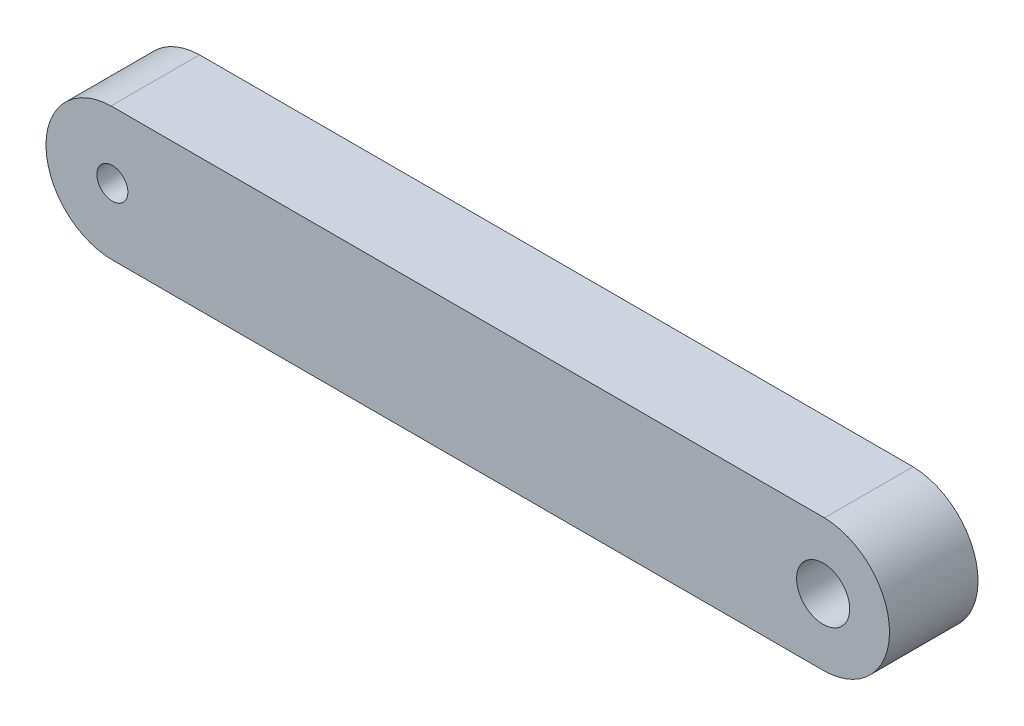
ISO-10303-21;
HEADER;
FILE_DESCRIPTION(('STEP AP214'),'2;1');
FILE_NAME('part.step','',(''),(''),'','','');
FILE_SCHEMA(('AUTOMOTIVE_DESIGN { 1 0 10303 214 1 1 1 1 }'));
ENDSEC;
DATA;
#1=APPLICATION_CONTEXT('core data for automotive mechanical design processes');
#2=APPLICATION_PROTOCOL_DEFINITION('international standard','automotive_design',2000,#1);
#3=PRODUCT_CONTEXT('',#1,'mechanical');
#4=PRODUCT('Part','Part','',(#3));
#5=PRODUCT_RELATED_PRODUCT_CATEGORY('part','',(#4));
#6=PRODUCT_DEFINITION_FORMATION('','',#4);
#7=PRODUCT_DEFINITION_CONTEXT('part definition',#1,'design');
#8=PRODUCT_DEFINITION('design','',#6,#7);
#9=PRODUCT_DEFINITION_SHAPE('','',#8);
#10=(LENGTH_UNIT() NAMED_UNIT(*) SI_UNIT(.MILLI.,.METRE.));
#11=(NAMED_UNIT(*) PLANE_ANGLE_UNIT() SI_UNIT($,.RADIAN.));
#12=(NAMED_UNIT(*) SI_UNIT($,.STERADIAN.) SOLID_ANGLE_UNIT());
#13=UNCERTAINTY_MEASURE_WITH_UNIT(LENGTH_MEASURE(1.E-05),#10,'distance_accuracy_value','');
#14=(GEOMETRIC_REPRESENTATION_CONTEXT(3) GLOBAL_UNCERTAINTY_ASSIGNED_CONTEXT((#13)) GLOBAL_UNIT_ASSIGNED_CONTEXT((#10,
#11,#12)) REPRESENTATION_CONTEXT('',''));
#15=CARTESIAN_POINT('',(0.,0.,0.));
#16=DIRECTION('',(0.,0.,1.));
#17=DIRECTION('',(1.,0.,0.));
#18=AXIS2_PLACEMENT_3D('',#15,#16,#17);
#19=CARTESIAN_POINT('',(0.,9.82318225199968,10.));
#20=DIRECTION('',(0.,1.,0.));
#21=DIRECTION('',(0.,0.,1.));
#22=AXIS2_PLACEMENT_3D('',#19,#20,#21);
#23=PLANE('',#22);
#24=DIRECTION('',(1.,0.,0.));
#25=VECTOR('',#24,1.);
#26=CARTESIAN_POINT('',(0.,9.82318225199968,0.));
#27=LINE('',#26,#25);
#28=CARTESIAN_POINT('',(-47.2764284813482,9.82318225199968,0.));
#29=VERTEX_POINT('',#28);
#30=CARTESIAN_POINT('',(33.3315741592488,9.82318225199968,0.));
#31=VERTEX_POINT('',#30);
#32=EDGE_CURVE('E115',#29,#31,#27,.T.);
#33=ORIENTED_EDGE('',*,*,#32,.F.);
#34=DIRECTION('',(0.,0.,-1.));
#35=VECTOR('',#34,1.);
#36=CARTESIAN_POINT('',(-47.2764284813482,9.82318225199968,10.));
#37=LINE('',#36,#35);
#38=CARTESIAN_POINT('',(-47.2764284813482,9.82318225199968,10.));
#39=VERTEX_POINT('',#38);
#40=EDGE_CURVE('E11',#39,#29,#37,.T.);
#41=ORIENTED_EDGE('',*,*,#40,.F.);
#42=DIRECTION('',(1.,0.,0.));
#43=VECTOR('',#42,1.);
#44=CARTESIAN_POINT('',(0.,9.82318225199968,10.));
#45=LINE('',#44,#43);
#46=CARTESIAN_POINT('',(33.3315741592488,9.82318225199968,10.));
#47=VERTEX_POINT('',#46);
#48=EDGE_CURVE('E97',#39,#47,#45,.T.);
#49=ORIENTED_EDGE('',*,*,#48,.T.);
#50=DIRECTION('',(0.,0.,-1.));
#51=VECTOR('',#50,1.);
#52=CARTESIAN_POINT('',(33.3315741592488,9.82318225199968,10.));
#53=LINE('',#52,#51);
#54=EDGE_CURVE('E78',#47,#31,#53,.T.);
#55=ORIENTED_EDGE('',*,*,#54,.T.);
#56=EDGE_LOOP('',(#33,#41,#49,#55));
#57=FACE_BOUND('',#56,.T.);
#58=ADVANCED_FACE('F39',(#57),#23,.T.);
#59=CARTESIAN_POINT('',(-47.1244278211989,2.32472269024204,10.));
#60=DIRECTION('',(0.,0.,-1.));
#61=DIRECTION('',(-1.,0.,0.));
#62=AXIS2_PLACEMENT_3D('',#59,#60,#61);
#63=CYLINDRICAL_SURFACE('',#62,7.5);
#64=CARTESIAN_POINT('',(-47.1244278211989,2.32472269024204,0.));
#65=DIRECTION('',(0.,0.,1.));
#66=DIRECTION('',(1.,0.,0.));
#67=AXIS2_PLACEMENT_3D('',#64,#65,#66);
#68=CIRCLE('',#67,7.5);
#69=CARTESIAN_POINT('',(-46.9724271610497,-5.17373687151557,0.));
#70=VERTEX_POINT('',#69);
#71=EDGE_CURVE('E102',#29,#70,#68,.T.);
#72=ORIENTED_EDGE('',*,*,#71,.T.);
#73=DIRECTION('',(0.,0.,-1.));
#74=VECTOR('',#73,1.);
#75=CARTESIAN_POINT('',(-46.9724271610497,-5.17373687151557,10.));
#76=LINE('',#75,#74);
#77=CARTESIAN_POINT('',(-46.9724271610497,-5.17373687151557,10.));
#78=VERTEX_POINT('',#77);
#79=EDGE_CURVE('E48',#78,#70,#76,.T.);
#80=ORIENTED_EDGE('',*,*,#79,.F.);
#81=CARTESIAN_POINT('',(-47.1244278211989,2.32472269024204,10.));
#82=DIRECTION('',(0.,0.,1.));
#83=DIRECTION('',(1.,0.,0.));
#84=AXIS2_PLACEMENT_3D('',#81,#82,#83);
#85=CIRCLE('',#84,7.5);
#86=EDGE_CURVE('E93',#39,#78,#85,.T.);
#87=ORIENTED_EDGE('',*,*,#86,.F.);
#88=ORIENTED_EDGE('',*,*,#40,.T.);
#89=EDGE_LOOP('',(#72,#80,#87,#88));
#90=FACE_BOUND('',#89,.T.);
#91=ADVANCED_FACE('F100',(#90),#63,.T.);
#92=CARTESIAN_POINT('',(0.,-5.17373687151555,10.));
#93=DIRECTION('',(0.,1.,0.));
#94=DIRECTION('',(-1.,0.,0.));
#95=AXIS2_PLACEMENT_3D('',#92,#93,#94);
#96=PLANE('',#95);
#97=DIRECTION('',(1.,0.,0.));
#98=VECTOR('',#97,1.);
#99=CARTESIAN_POINT('',(0.,-5.17373687151555,0.));
#100=LINE('',#99,#98);
#101=CARTESIAN_POINT('',(33.0275728389503,-5.17373687151554,0.));
#102=VERTEX_POINT('',#101);
#103=EDGE_CURVE('E112',#70,#102,#100,.T.);
#104=ORIENTED_EDGE('',*,*,#103,.T.);
#105=DIRECTION('',(0.,0.,-1.));
#106=VECTOR('',#105,1.);
#107=CARTESIAN_POINT('',(33.0275728389503,-5.17373687151554,10.));
#108=LINE('',#107,#106);
#109=CARTESIAN_POINT('',(33.0275728389503,-5.17373687151554,10.));
#110=VERTEX_POINT('',#109);
#111=EDGE_CURVE('E92',#110,#102,#108,.T.);
#112=ORIENTED_EDGE('',*,*,#111,.F.);
#113=DIRECTION('',(1.,0.,0.));
#114=VECTOR('',#113,1.);
#115=CARTESIAN_POINT('',(0.,-5.17373687151555,10.));
#116=LINE('',#115,#114);
#117=EDGE_CURVE('E86',#78,#110,#116,.T.);
#118=ORIENTED_EDGE('',*,*,#117,.F.);
#119=ORIENTED_EDGE('',*,*,#79,.T.);
#120=EDGE_LOOP('',(#104,#112,#118,#119));
#121=FACE_BOUND('',#120,.T.);
#122=ADVANCED_FACE('F89',(#121),#96,.F.);
#123=CARTESIAN_POINT('',(33.1795734990995,2.32472269024207,10.));
#124=DIRECTION('',(0.,0.,-1.));
#125=DIRECTION('',(-1.,0.,0.));
#126=AXIS2_PLACEMENT_3D('',#123,#124,#125);
#127=CYLINDRICAL_SURFACE('',#126,7.49999999999999);
#128=CARTESIAN_POINT('',(33.1795734990995,2.32472269024207,0.));
#129=DIRECTION('',(0.,0.,1.));
#130=DIRECTION('',(1.,0.,0.));
#131=AXIS2_PLACEMENT_3D('',#128,#129,#130);
#132=CIRCLE('',#131,7.49999999999999);
#133=EDGE_CURVE('E71',#102,#31,#132,.T.);
#134=ORIENTED_EDGE('',*,*,#133,.T.);
#135=ORIENTED_EDGE('',*,*,#54,.F.);
#136=CARTESIAN_POINT('',(33.1795734990995,2.32472269024207,10.));
#137=DIRECTION('',(0.,0.,1.));
#138=DIRECTION('',(1.,0.,0.));
#139=AXIS2_PLACEMENT_3D('',#136,#137,#138);
#140=CIRCLE('',#139,7.49999999999999);
#141=EDGE_CURVE('E56',#110,#47,#140,.T.);
#142=ORIENTED_EDGE('',*,*,#141,.F.);
#143=ORIENTED_EDGE('',*,*,#111,.T.);
#144=EDGE_LOOP('',(#134,#135,#142,#143));
#145=FACE_BOUND('',#144,.T.);
#146=ADVANCED_FACE('F149',(#145),#127,.T.);
#147=CARTESIAN_POINT('',(-47.1244278211989,2.32472269024204,10.));
#148=DIRECTION('',(0.,0.,-1.));
#149=DIRECTION('',(-1.,0.,0.));
#150=AXIS2_PLACEMENT_3D('',#147,#148,#149);
#151=CYLINDRICAL_SURFACE('',#150,1.75);
#152=CARTESIAN_POINT('',(-47.1244278211989,2.32472269024204,10.));
#153=DIRECTION('',(0.,0.,1.));
#154=DIRECTION('',(1.,0.,0.));
#155=AXIS2_PLACEMENT_3D('',#152,#153,#154);
#156=CIRCLE('',#155,1.75);
#157=CARTESIAN_POINT('',(-45.3744278211989,2.32472269024204,10.));
#158=VERTEX_POINT('',#157);
#159=EDGE_CURVE('E110',#158,#158,#156,.T.);
#160=ORIENTED_EDGE('',*,*,#159,.T.);
#161=EDGE_LOOP('',(#160));
#162=FACE_BOUND('',#161,.T.);
#163=CARTESIAN_POINT('',(-47.1244278211989,2.32472269024204,0.));
#164=DIRECTION('',(0.,0.,1.));
#165=DIRECTION('',(1.,0.,0.));
#166=AXIS2_PLACEMENT_3D('',#163,#164,#165);
#167=CIRCLE('',#166,1.75);
#168=CARTESIAN_POINT('',(-45.3744278211989,2.32472269024204,0.));
#169=VERTEX_POINT('',#168);
#170=EDGE_CURVE('E117',#169,#169,#167,.T.);
#171=ORIENTED_EDGE('',*,*,#170,.F.);
#172=EDGE_LOOP('',(#171));
#173=FACE_BOUND('',#172,.T.);
#174=ADVANCED_FACE('F41',(#162,#173),#151,.F.);
#175=CARTESIAN_POINT('',(33.1795734990995,2.32472269024207,10.));
#176=DIRECTION('',(0.,0.,-1.));
#177=DIRECTION('',(-1.,0.,0.));
#178=AXIS2_PLACEMENT_3D('',#175,#176,#177);
#179=CYLINDRICAL_SURFACE('',#178,2.99999999999999);
#180=CARTESIAN_POINT('',(33.1795734990995,2.32472269024207,10.));
#181=DIRECTION('',(0.,0.,1.));
#182=DIRECTION('',(1.,0.,0.));
#183=AXIS2_PLACEMENT_3D('',#180,#181,#182);
#184=CIRCLE('',#183,2.99999999999999);
#185=CARTESIAN_POINT('',(36.1795734990995,2.32472269024207,10.));
#186=VERTEX_POINT('',#185);
#187=EDGE_CURVE('E106',#186,#186,#184,.T.);
#188=ORIENTED_EDGE('',*,*,#187,.T.);
#189=EDGE_LOOP('',(#188));
#190=FACE_BOUND('',#189,.T.);
#191=CARTESIAN_POINT('',(33.1795734990995,2.32472269024207,0.));
#192=DIRECTION('',(0.,0.,1.));
#193=DIRECTION('',(1.,0.,0.));
#194=AXIS2_PLACEMENT_3D('',#191,#192,#193);
#195=CIRCLE('',#194,2.99999999999999);
#196=CARTESIAN_POINT('',(36.1795734990995,2.32472269024207,0.));
#197=VERTEX_POINT('',#196);
#198=EDGE_CURVE('E107',#197,#197,#195,.T.);
#199=ORIENTED_EDGE('',*,*,#198,.F.);
#200=EDGE_LOOP('',(#199));
#201=FACE_BOUND('',#200,.T.);
#202=ADVANCED_FACE('F131',(#190,#201),#179,.F.);
#203=CARTESIAN_POINT('',(0.,0.,10.));
#204=DIRECTION('',(0.,0.,1.));
#205=DIRECTION('',(1.,0.,0.));
#206=AXIS2_PLACEMENT_3D('',#203,#204,#205);
#207=PLANE('',#206);
#208=ORIENTED_EDGE('',*,*,#159,.F.);
#209=EDGE_LOOP('',(#208));
#210=FACE_BOUND('',#209,.T.);
#211=ORIENTED_EDGE('',*,*,#48,.F.);
#212=ORIENTED_EDGE('',*,*,#86,.T.);
#213=ORIENTED_EDGE('',*,*,#117,.T.);
#214=ORIENTED_EDGE('',*,*,#141,.T.);
#215=EDGE_LOOP('',(#211,#212,#213,#214));
#216=FACE_BOUND('',#215,.T.);
#217=ORIENTED_EDGE('',*,*,#187,.F.);
#218=EDGE_LOOP('',(#217));
#219=FACE_BOUND('',#218,.T.);
#220=ADVANCED_FACE('F95',(#210,#216,#219),#207,.T.);
#221=CARTESIAN_POINT('',(0.,0.,0.));
#222=DIRECTION('',(0.,0.,1.));
#223=DIRECTION('',(1.,0.,0.));
#224=AXIS2_PLACEMENT_3D('',#221,#222,#223);
#225=PLANE('',#224);
#226=ORIENTED_EDGE('',*,*,#170,.T.);
#227=EDGE_LOOP('',(#226));
#228=FACE_BOUND('',#227,.T.);
#229=ORIENTED_EDGE('',*,*,#32,.T.);
#230=ORIENTED_EDGE('',*,*,#133,.F.);
#231=ORIENTED_EDGE('',*,*,#103,.F.);
#232=ORIENTED_EDGE('',*,*,#71,.F.);
#233=EDGE_LOOP('',(#229,#230,#231,#232));
#234=FACE_BOUND('',#233,.T.);
#235=ORIENTED_EDGE('',*,*,#198,.T.);
#236=EDGE_LOOP('',(#235));
#237=FACE_BOUND('',#236,.T.);
#238=ADVANCED_FACE('F130',(#228,#234,#237),#225,.F.);
#239=CLOSED_SHELL('',(#58,#91,#122,#146,#174,#202,#220,#238));
#240=MANIFOLD_SOLID_BREP('B2',#239);
#241=ADVANCED_BREP_SHAPE_REPRESENTATION('',(#18,#240),#14);
#242=SHAPE_DEFINITION_REPRESENTATION(#9,#241);
ENDSEC;
END-ISO-10303-21;
